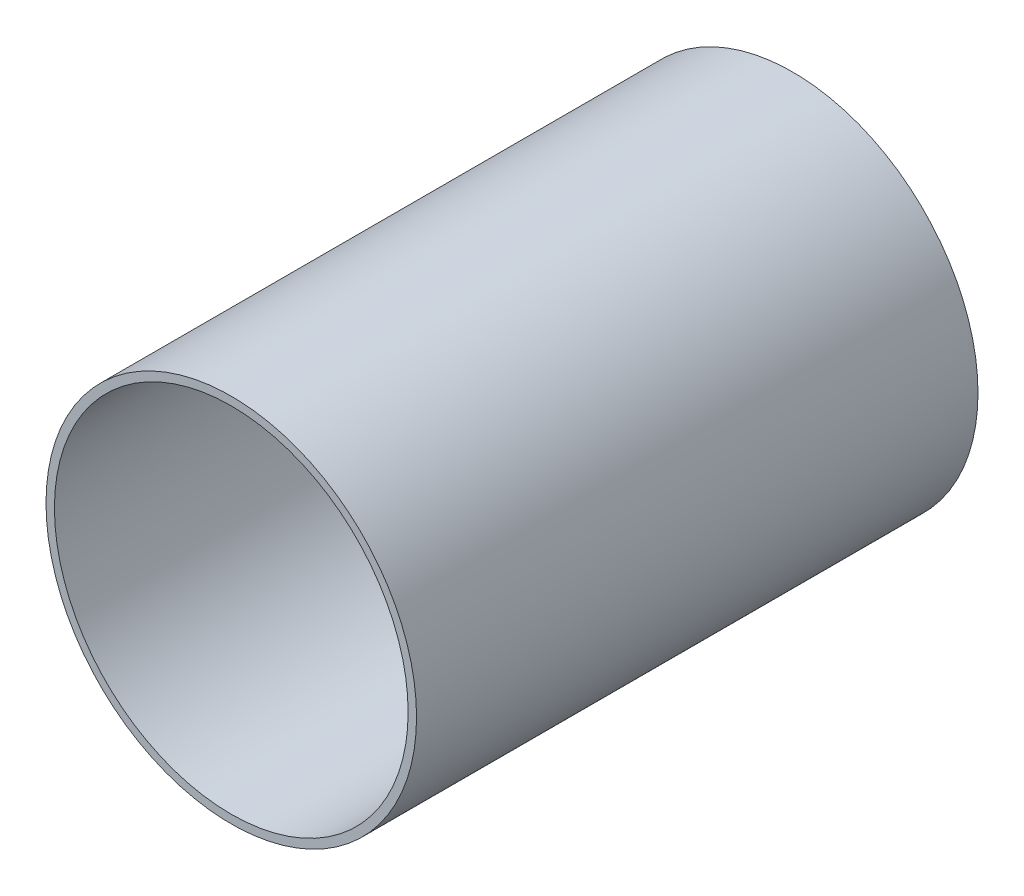
ISO-10303-21;
HEADER;
FILE_DESCRIPTION(('STEP AP214'),'2;1');
FILE_NAME('part.step','',(''),(''),'','','');
FILE_SCHEMA(('AUTOMOTIVE_DESIGN { 1 0 10303 214 1 1 1 1 }'));
ENDSEC;
DATA;
#1=APPLICATION_CONTEXT('core data for automotive mechanical design processes');
#2=APPLICATION_PROTOCOL_DEFINITION('international standard','automotive_design',2000,#1);
#3=PRODUCT_CONTEXT('',#1,'mechanical');
#4=PRODUCT('Part','Part','',(#3));
#5=PRODUCT_RELATED_PRODUCT_CATEGORY('part','',(#4));
#6=PRODUCT_DEFINITION_FORMATION('','',#4);
#7=PRODUCT_DEFINITION_CONTEXT('part definition',#1,'design');
#8=PRODUCT_DEFINITION('design','',#6,#7);
#9=PRODUCT_DEFINITION_SHAPE('','',#8);
#10=(LENGTH_UNIT() NAMED_UNIT(*) SI_UNIT(.MILLI.,.METRE.));
#11=(NAMED_UNIT(*) PLANE_ANGLE_UNIT() SI_UNIT($,.RADIAN.));
#12=(NAMED_UNIT(*) SI_UNIT($,.STERADIAN.) SOLID_ANGLE_UNIT());
#13=UNCERTAINTY_MEASURE_WITH_UNIT(LENGTH_MEASURE(1.E-05),#10,'distance_accuracy_value','');
#14=(GEOMETRIC_REPRESENTATION_CONTEXT(3) GLOBAL_UNCERTAINTY_ASSIGNED_CONTEXT((#13)) GLOBAL_UNIT_ASSIGNED_CONTEXT((#10,
#11,#12)) REPRESENTATION_CONTEXT('',''));
#15=CARTESIAN_POINT('',(0.,0.,0.));
#16=DIRECTION('',(0.,0.,1.));
#17=DIRECTION('',(1.,0.,0.));
#18=AXIS2_PLACEMENT_3D('',#15,#16,#17);
#19=CARTESIAN_POINT('',(0.,0.,100.));
#20=DIRECTION('',(0.,0.,1.));
#21=DIRECTION('',(1.,0.,0.));
#22=AXIS2_PLACEMENT_3D('',#19,#20,#21);
#23=PLANE('',#22);
#24=CARTESIAN_POINT('',(0.,0.,100.));
#25=DIRECTION('',(0.,0.,1.));
#26=DIRECTION('',(1.,0.,0.));
#27=AXIS2_PLACEMENT_3D('',#24,#25,#26);
#28=CIRCLE('',#27,33.);
#29=CARTESIAN_POINT('',(33.,0.,100.));
#30=VERTEX_POINT('',#29);
#31=EDGE_CURVE('E10',#30,#30,#28,.T.);
#32=ORIENTED_EDGE('',*,*,#31,.T.);
#33=EDGE_LOOP('',(#32));
#34=FACE_BOUND('',#33,.T.);
#35=CARTESIAN_POINT('',(0.,0.,100.));
#36=DIRECTION('',(0.,0.,1.));
#37=DIRECTION('',(1.,0.,0.));
#38=AXIS2_PLACEMENT_3D('',#35,#36,#37);
#39=CIRCLE('',#38,31.5);
#40=CARTESIAN_POINT('',(31.5,0.,100.));
#41=VERTEX_POINT('',#40);
#42=EDGE_CURVE('E44',#41,#41,#39,.T.);
#43=ORIENTED_EDGE('',*,*,#42,.F.);
#44=EDGE_LOOP('',(#43));
#45=FACE_BOUND('',#44,.T.);
#46=ADVANCED_FACE('F33',(#34,#45),#23,.T.);
#47=CARTESIAN_POINT('',(0.,0.,0.));
#48=DIRECTION('',(0.,0.,1.));
#49=DIRECTION('',(1.,0.,0.));
#50=AXIS2_PLACEMENT_3D('',#47,#48,#49);
#51=PLANE('',#50);
#52=CARTESIAN_POINT('',(0.,0.,0.));
#53=DIRECTION('',(0.,0.,1.));
#54=DIRECTION('',(1.,0.,0.));
#55=AXIS2_PLACEMENT_3D('',#52,#53,#54);
#56=CIRCLE('',#55,33.);
#57=CARTESIAN_POINT('',(33.,0.,0.));
#58=VERTEX_POINT('',#57);
#59=EDGE_CURVE('E37',#58,#58,#56,.T.);
#60=ORIENTED_EDGE('',*,*,#59,.F.);
#61=EDGE_LOOP('',(#60));
#62=FACE_BOUND('',#61,.T.);
#63=CARTESIAN_POINT('',(0.,0.,0.));
#64=DIRECTION('',(0.,0.,1.));
#65=DIRECTION('',(1.,0.,0.));
#66=AXIS2_PLACEMENT_3D('',#63,#64,#65);
#67=CIRCLE('',#66,31.5);
#68=CARTESIAN_POINT('',(31.5,0.,0.));
#69=VERTEX_POINT('',#68);
#70=EDGE_CURVE('E46',#69,#69,#67,.T.);
#71=ORIENTED_EDGE('',*,*,#70,.T.);
#72=EDGE_LOOP('',(#71));
#73=FACE_BOUND('',#72,.T.);
#74=ADVANCED_FACE('F56',(#62,#73),#51,.F.);
#75=CARTESIAN_POINT('',(0.,0.,100.));
#76=DIRECTION('',(0.,0.,-1.));
#77=DIRECTION('',(-1.,0.,0.));
#78=AXIS2_PLACEMENT_3D('',#75,#76,#77);
#79=CYLINDRICAL_SURFACE('',#78,33.);
#80=ORIENTED_EDGE('',*,*,#31,.F.);
#81=EDGE_LOOP('',(#80));
#82=FACE_BOUND('',#81,.T.);
#83=ORIENTED_EDGE('',*,*,#59,.T.);
#84=EDGE_LOOP('',(#83));
#85=FACE_BOUND('',#84,.T.);
#86=ADVANCED_FACE('F35',(#82,#85),#79,.T.);
#87=CARTESIAN_POINT('',(0.,0.,100.));
#88=DIRECTION('',(0.,0.,-1.));
#89=DIRECTION('',(-1.,0.,0.));
#90=AXIS2_PLACEMENT_3D('',#87,#88,#89);
#91=CYLINDRICAL_SURFACE('',#90,31.5);
#92=ORIENTED_EDGE('',*,*,#42,.T.);
#93=EDGE_LOOP('',(#92));
#94=FACE_BOUND('',#93,.T.);
#95=ORIENTED_EDGE('',*,*,#70,.F.);
#96=EDGE_LOOP('',(#95));
#97=FACE_BOUND('',#96,.T.);
#98=ADVANCED_FACE('F52',(#94,#97),#91,.F.);
#99=CLOSED_SHELL('',(#46,#74,#86,#98));
#100=MANIFOLD_SOLID_BREP('B2',#99);
#101=ADVANCED_BREP_SHAPE_REPRESENTATION('',(#18,#100),#14);
#102=SHAPE_DEFINITION_REPRESENTATION(#9,#101);
ENDSEC;
END-ISO-10303-21;
